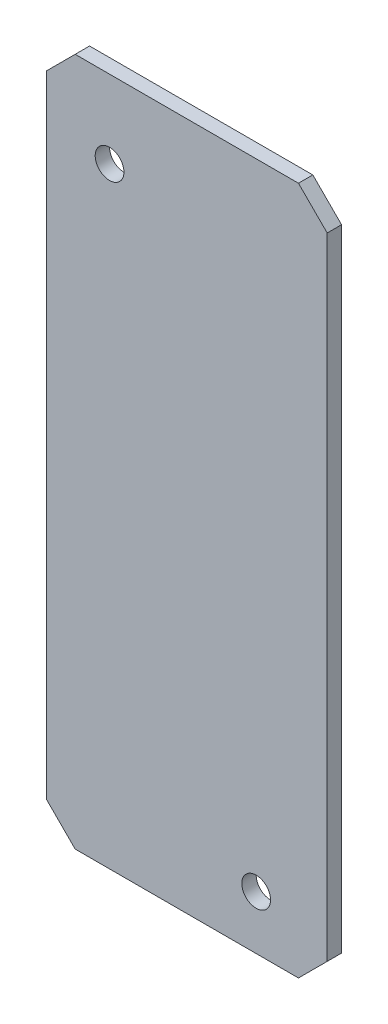
ISO-10303-21;
HEADER;
FILE_DESCRIPTION(('STEP AP214'),'2;1');
FILE_NAME('part.step','',(''),(''),'','','');
FILE_SCHEMA(('AUTOMOTIVE_DESIGN { 1 0 10303 214 1 1 1 1 }'));
ENDSEC;
DATA;
#1=APPLICATION_CONTEXT('core data for automotive mechanical design processes');
#2=APPLICATION_PROTOCOL_DEFINITION('international standard','automotive_design',2000,#1);
#3=PRODUCT_CONTEXT('',#1,'mechanical');
#4=PRODUCT('Part','Part','',(#3));
#5=PRODUCT_RELATED_PRODUCT_CATEGORY('part','',(#4));
#6=PRODUCT_DEFINITION_FORMATION('','',#4);
#7=PRODUCT_DEFINITION_CONTEXT('part definition',#1,'design');
#8=PRODUCT_DEFINITION('design','',#6,#7);
#9=PRODUCT_DEFINITION_SHAPE('','',#8);
#10=(LENGTH_UNIT() NAMED_UNIT(*) SI_UNIT(.MILLI.,.METRE.));
#11=(NAMED_UNIT(*) PLANE_ANGLE_UNIT() SI_UNIT($,.RADIAN.));
#12=(NAMED_UNIT(*) SI_UNIT($,.STERADIAN.) SOLID_ANGLE_UNIT());
#13=UNCERTAINTY_MEASURE_WITH_UNIT(LENGTH_MEASURE(1.E-05),#10,'distance_accuracy_value','');
#14=(GEOMETRIC_REPRESENTATION_CONTEXT(3) GLOBAL_UNCERTAINTY_ASSIGNED_CONTEXT((#13)) GLOBAL_UNIT_ASSIGNED_CONTEXT((#10,
#11,#12)) REPRESENTATION_CONTEXT('',''));
#15=CARTESIAN_POINT('',(0.,0.,0.));
#16=DIRECTION('',(0.,0.,1.));
#17=DIRECTION('',(1.,0.,0.));
#18=AXIS2_PLACEMENT_3D('',#15,#16,#17);
#19=CARTESIAN_POINT('',(-51.866048250082,-84.51886669578,1.));
#20=DIRECTION('',(0.,0.,1.));
#21=DIRECTION('',(1.,0.,0.));
#22=AXIS2_PLACEMENT_3D('',#19,#20,#21);
#23=PLANE('',#22);
#24=CARTESIAN_POINT('',(-37.2688330071628,-80.7890726351597,1.));
#25=DIRECTION('',(0.,0.,1.));
#26=DIRECTION('',(1.,0.,0.));
#27=AXIS2_PLACEMENT_3D('',#24,#25,#26);
#28=CIRCLE('',#27,0.999999999999998);
#29=CARTESIAN_POINT('',(-36.2688330071628,-80.7890726351597,1.));
#30=VERTEX_POINT('',#29);
#31=EDGE_CURVE('E132',#30,#30,#28,.T.);
#32=ORIENTED_EDGE('',*,*,#31,.F.);
#33=EDGE_LOOP('',(#32));
#34=FACE_BOUND('',#33,.T.);
#35=DIRECTION('',(0.,-1.,0.));
#36=VECTOR('',#35,1.);
#37=CARTESIAN_POINT('',(-51.866048250082,-36.6136660966542,1.));
#38=LINE('',#37,#36);
#39=CARTESIAN_POINT('',(-51.866048250082,-38.6136660966542,1.));
#40=VERTEX_POINT('',#39);
#41=CARTESIAN_POINT('',(-51.866048250082,-82.51886669578,1.));
#42=VERTEX_POINT('',#41);
#43=EDGE_CURVE('E137',#40,#42,#38,.T.);
#44=ORIENTED_EDGE('',*,*,#43,.T.);
#45=DIRECTION('',(-0.707106781186545,0.70710678118655,0.));
#46=VECTOR('',#45,1.);
#47=CARTESIAN_POINT('',(-50.866048250082,-83.51886669578,1.));
#48=LINE('',#47,#46);
#49=CARTESIAN_POINT('',(-49.866048250082,-84.51886669578,1.));
#50=VERTEX_POINT('',#49);
#51=EDGE_CURVE('E158',#42,#50,#48,.F.);
#52=ORIENTED_EDGE('',*,*,#51,.T.);
#53=DIRECTION('',(1.,0.,0.));
#54=VECTOR('',#53,1.);
#55=CARTESIAN_POINT('',(-51.866048250082,-84.51886669578,1.));
#56=LINE('',#55,#54);
#57=CARTESIAN_POINT('',(-34.325499768879,-84.51886669578,1.));
#58=VERTEX_POINT('',#57);
#59=EDGE_CURVE('E119',#50,#58,#56,.T.);
#60=ORIENTED_EDGE('',*,*,#59,.T.);
#61=DIRECTION('',(-0.70710678118655,-0.707106781186545,0.));
#62=VECTOR('',#61,1.);
#63=CARTESIAN_POINT('',(-43.0957740094805,-93.2891409363815,1.));
#64=LINE('',#63,#62);
#65=CARTESIAN_POINT('',(-32.3254997688789,-82.51886669578,1.));
#66=VERTEX_POINT('',#65);
#67=EDGE_CURVE('E156',#58,#66,#64,.F.);
#68=ORIENTED_EDGE('',*,*,#67,.T.);
#69=DIRECTION('',(0.,1.,0.));
#70=VECTOR('',#69,1.);
#71=CARTESIAN_POINT('',(-32.3254997688789,-36.6136660966542,1.));
#72=LINE('',#71,#70);
#73=CARTESIAN_POINT('',(-32.325499768879,-38.6136660966542,1.));
#74=VERTEX_POINT('',#73);
#75=EDGE_CURVE('E141',#66,#74,#72,.T.);
#76=ORIENTED_EDGE('',*,*,#75,.T.);
#77=DIRECTION('',(0.707106781186546,-0.707106781186549,0.));
#78=VECTOR('',#77,1.);
#79=CARTESIAN_POINT('',(-19.1431737099176,-51.7959921556157,1.));
#80=LINE('',#79,#78);
#81=CARTESIAN_POINT('',(-34.3254997688789,-36.6136660966542,1.));
#82=VERTEX_POINT('',#81);
#83=EDGE_CURVE('E54',#74,#82,#80,.F.);
#84=ORIENTED_EDGE('',*,*,#83,.T.);
#85=DIRECTION('',(-1.,0.,0.));
#86=VECTOR('',#85,1.);
#87=CARTESIAN_POINT('',(-51.866048250082,-36.6136660966542,1.));
#88=LINE('',#87,#86);
#89=CARTESIAN_POINT('',(-49.866048250082,-36.6136660966542,1.));
#90=VERTEX_POINT('',#89);
#91=EDGE_CURVE('E143',#82,#90,#88,.T.);
#92=ORIENTED_EDGE('',*,*,#91,.T.);
#93=DIRECTION('',(0.707106781186549,0.707106781186546,0.));
#94=VECTOR('',#93,1.);
#95=CARTESIAN_POINT('',(-74.8186485496449,-61.566266396217,1.));
#96=LINE('',#95,#94);
#97=EDGE_CURVE('E153',#90,#40,#96,.F.);
#98=ORIENTED_EDGE('',*,*,#97,.T.);
#99=EDGE_LOOP('',(#44,#52,#60,#68,#76,#84,#92,#98));
#100=FACE_BOUND('',#99,.T.);
#101=CARTESIAN_POINT('',(-47.4714587140537,-42.0223916794583,1.));
#102=DIRECTION('',(0.,0.,1.));
#103=DIRECTION('',(1.,0.,0.));
#104=AXIS2_PLACEMENT_3D('',#101,#102,#103);
#105=CIRCLE('',#104,0.999999999999998);
#106=CARTESIAN_POINT('',(-46.4714587140537,-42.0223916794583,1.));
#107=VERTEX_POINT('',#106);
#108=EDGE_CURVE('E290',#107,#107,#105,.T.);
#109=ORIENTED_EDGE('',*,*,#108,.F.);
#110=EDGE_LOOP('',(#109));
#111=FACE_BOUND('',#110,.T.);
#112=ADVANCED_FACE('F33',(#34,#100,#111),#23,.T.);
#113=CARTESIAN_POINT('',(-51.866048250082,-84.51886669578,0.));
#114=DIRECTION('',(0.,0.,1.));
#115=DIRECTION('',(1.,0.,0.));
#116=AXIS2_PLACEMENT_3D('',#113,#114,#115);
#117=PLANE('',#116);
#118=CARTESIAN_POINT('',(-37.2688330071628,-80.7890726351597,0.));
#119=DIRECTION('',(0.,0.,1.));
#120=DIRECTION('',(1.,0.,0.));
#121=AXIS2_PLACEMENT_3D('',#118,#119,#120);
#122=CIRCLE('',#121,0.999999999999998);
#123=CARTESIAN_POINT('',(-36.2688330071628,-80.7890726351597,0.));
#124=VERTEX_POINT('',#123);
#125=EDGE_CURVE('E289',#124,#124,#122,.T.);
#126=ORIENTED_EDGE('',*,*,#125,.T.);
#127=EDGE_LOOP('',(#126));
#128=FACE_BOUND('',#127,.T.);
#129=DIRECTION('',(1.,0.,0.));
#130=VECTOR('',#129,1.);
#131=CARTESIAN_POINT('',(-51.866048250082,-84.51886669578,0.));
#132=LINE('',#131,#130);
#133=CARTESIAN_POINT('',(-49.866048250082,-84.51886669578,0.));
#134=VERTEX_POINT('',#133);
#135=CARTESIAN_POINT('',(-34.325499768879,-84.51886669578,0.));
#136=VERTEX_POINT('',#135);
#137=EDGE_CURVE('E116',#134,#136,#132,.T.);
#138=ORIENTED_EDGE('',*,*,#137,.F.);
#139=DIRECTION('',(0.707106781186545,-0.70710678118655,0.));
#140=VECTOR('',#139,1.);
#141=CARTESIAN_POINT('',(-49.866048250082,-84.51886669578,0.));
#142=LINE('',#141,#140);
#143=CARTESIAN_POINT('',(-51.866048250082,-82.51886669578,0.));
#144=VERTEX_POINT('',#143);
#145=EDGE_CURVE('E99',#134,#144,#142,.F.);
#146=ORIENTED_EDGE('',*,*,#145,.T.);
#147=DIRECTION('',(0.,-1.,0.));
#148=VECTOR('',#147,1.);
#149=CARTESIAN_POINT('',(-51.866048250082,-36.6136660966542,0.));
#150=LINE('',#149,#148);
#151=CARTESIAN_POINT('',(-51.866048250082,-38.6136660966542,0.));
#152=VERTEX_POINT('',#151);
#153=EDGE_CURVE('E127',#152,#144,#150,.T.);
#154=ORIENTED_EDGE('',*,*,#153,.F.);
#155=DIRECTION('',(-0.707106781186549,-0.707106781186546,0.));
#156=VECTOR('',#155,1.);
#157=CARTESIAN_POINT('',(-51.866048250082,-38.6136660966542,0.));
#158=LINE('',#157,#156);
#159=CARTESIAN_POINT('',(-49.866048250082,-36.6136660966542,0.));
#160=VERTEX_POINT('',#159);
#161=EDGE_CURVE('E120',#152,#160,#158,.F.);
#162=ORIENTED_EDGE('',*,*,#161,.T.);
#163=DIRECTION('',(-1.,0.,0.));
#164=VECTOR('',#163,1.);
#165=CARTESIAN_POINT('',(-51.866048250082,-36.6136660966542,0.));
#166=LINE('',#165,#164);
#167=CARTESIAN_POINT('',(-34.325499768879,-36.6136660966542,0.));
#168=VERTEX_POINT('',#167);
#169=EDGE_CURVE('E130',#168,#160,#166,.T.);
#170=ORIENTED_EDGE('',*,*,#169,.F.);
#171=DIRECTION('',(-0.707106781186546,0.707106781186549,0.));
#172=VECTOR('',#171,1.);
#173=CARTESIAN_POINT('',(-34.3254997688789,-36.6136660966542,0.));
#174=LINE('',#173,#172);
#175=CARTESIAN_POINT('',(-32.3254997688789,-38.6136660966542,0.));
#176=VERTEX_POINT('',#175);
#177=EDGE_CURVE('E147',#168,#176,#174,.F.);
#178=ORIENTED_EDGE('',*,*,#177,.T.);
#179=DIRECTION('',(0.,1.,0.));
#180=VECTOR('',#179,1.);
#181=CARTESIAN_POINT('',(-32.3254997688789,-36.6136660966542,0.));
#182=LINE('',#181,#180);
#183=CARTESIAN_POINT('',(-32.3254997688789,-82.51886669578,0.));
#184=VERTEX_POINT('',#183);
#185=EDGE_CURVE('E126',#184,#176,#182,.T.);
#186=ORIENTED_EDGE('',*,*,#185,.F.);
#187=DIRECTION('',(0.70710678118655,0.707106781186545,0.));
#188=VECTOR('',#187,1.);
#189=CARTESIAN_POINT('',(-32.3254997688789,-82.51886669578,0.));
#190=LINE('',#189,#188);
#191=EDGE_CURVE('E110',#184,#136,#190,.F.);
#192=ORIENTED_EDGE('',*,*,#191,.T.);
#193=EDGE_LOOP('',(#138,#146,#154,#162,#170,#178,#186,#192));
#194=FACE_BOUND('',#193,.T.);
#195=CARTESIAN_POINT('',(-47.4714587140537,-42.0223916794583,0.));
#196=DIRECTION('',(0.,0.,1.));
#197=DIRECTION('',(1.,0.,0.));
#198=AXIS2_PLACEMENT_3D('',#195,#196,#197);
#199=CIRCLE('',#198,0.999999999999998);
#200=CARTESIAN_POINT('',(-46.4714587140537,-42.0223916794583,0.));
#201=VERTEX_POINT('',#200);
#202=EDGE_CURVE('E293',#201,#201,#199,.T.);
#203=ORIENTED_EDGE('',*,*,#202,.T.);
#204=EDGE_LOOP('',(#203));
#205=FACE_BOUND('',#204,.T.);
#206=ADVANCED_FACE('F123',(#128,#194,#205),#117,.F.);
#207=CARTESIAN_POINT('',(-51.866048250082,-36.6136660966542,1.));
#208=DIRECTION('',(1.,0.,0.));
#209=DIRECTION('',(0.,1.,0.));
#210=AXIS2_PLACEMENT_3D('',#207,#208,#209);
#211=PLANE('',#210);
#212=ORIENTED_EDGE('',*,*,#153,.T.);
#213=DIRECTION('',(0.,0.,1.));
#214=VECTOR('',#213,1.);
#215=CARTESIAN_POINT('',(-51.866048250082,-82.51886669578,1.));
#216=LINE('',#215,#214);
#217=EDGE_CURVE('E104',#144,#42,#216,.T.);
#218=ORIENTED_EDGE('',*,*,#217,.T.);
#219=ORIENTED_EDGE('',*,*,#43,.F.);
#220=DIRECTION('',(0.,0.,-1.));
#221=VECTOR('',#220,1.);
#222=CARTESIAN_POINT('',(-51.866048250082,-38.6136660966542,1.));
#223=LINE('',#222,#221);
#224=EDGE_CURVE('E109',#40,#152,#223,.T.);
#225=ORIENTED_EDGE('',*,*,#224,.T.);
#226=EDGE_LOOP('',(#212,#218,#219,#225));
#227=FACE_BOUND('',#226,.T.);
#228=ADVANCED_FACE('F35',(#227),#211,.F.);
#229=CARTESIAN_POINT('',(-51.866048250082,-84.51886669578,1.));
#230=DIRECTION('',(0.,1.,0.));
#231=DIRECTION('',(0.,0.,1.));
#232=AXIS2_PLACEMENT_3D('',#229,#230,#231);
#233=PLANE('',#232);
#234=ORIENTED_EDGE('',*,*,#59,.F.);
#235=DIRECTION('',(0.,0.,-1.));
#236=VECTOR('',#235,1.);
#237=CARTESIAN_POINT('',(-49.866048250082,-84.51886669578,1.));
#238=LINE('',#237,#236);
#239=EDGE_CURVE('E103',#50,#134,#238,.T.);
#240=ORIENTED_EDGE('',*,*,#239,.T.);
#241=ORIENTED_EDGE('',*,*,#137,.T.);
#242=DIRECTION('',(0.,0.,1.));
#243=VECTOR('',#242,1.);
#244=CARTESIAN_POINT('',(-34.325499768879,-84.51886669578,1.));
#245=LINE('',#244,#243);
#246=EDGE_CURVE('E121',#136,#58,#245,.T.);
#247=ORIENTED_EDGE('',*,*,#246,.T.);
#248=EDGE_LOOP('',(#234,#240,#241,#247));
#249=FACE_BOUND('',#248,.T.);
#250=ADVANCED_FACE('F115',(#249),#233,.F.);
#251=CARTESIAN_POINT('',(-32.3254997688789,-36.6136660966542,1.));
#252=DIRECTION('',(-1.,0.,0.));
#253=DIRECTION('',(0.,0.,1.));
#254=AXIS2_PLACEMENT_3D('',#251,#252,#253);
#255=PLANE('',#254);
#256=ORIENTED_EDGE('',*,*,#75,.F.);
#257=DIRECTION('',(0.,0.,-1.));
#258=VECTOR('',#257,1.);
#259=CARTESIAN_POINT('',(-32.3254997688789,-82.51886669578,1.));
#260=LINE('',#259,#258);
#261=EDGE_CURVE('E162',#66,#184,#260,.T.);
#262=ORIENTED_EDGE('',*,*,#261,.T.);
#263=ORIENTED_EDGE('',*,*,#185,.T.);
#264=DIRECTION('',(0.,0.,1.));
#265=VECTOR('',#264,1.);
#266=CARTESIAN_POINT('',(-32.3254997688789,-38.6136660966542,1.));
#267=LINE('',#266,#265);
#268=EDGE_CURVE('E160',#176,#74,#267,.T.);
#269=ORIENTED_EDGE('',*,*,#268,.T.);
#270=EDGE_LOOP('',(#256,#262,#263,#269));
#271=FACE_BOUND('',#270,.T.);
#272=ADVANCED_FACE('F167',(#271),#255,.F.);
#273=CARTESIAN_POINT('',(-51.866048250082,-36.6136660966542,1.));
#274=DIRECTION('',(0.,-1.,0.));
#275=DIRECTION('',(0.,0.,-1.));
#276=AXIS2_PLACEMENT_3D('',#273,#274,#275);
#277=PLANE('',#276);
#278=ORIENTED_EDGE('',*,*,#91,.F.);
#279=DIRECTION('',(0.,0.,-1.));
#280=VECTOR('',#279,1.);
#281=CARTESIAN_POINT('',(-34.3254997688789,-36.6136660966542,1.));
#282=LINE('',#281,#280);
#283=EDGE_CURVE('E11',#82,#168,#282,.T.);
#284=ORIENTED_EDGE('',*,*,#283,.T.);
#285=ORIENTED_EDGE('',*,*,#169,.T.);
#286=DIRECTION('',(0.,0.,1.));
#287=VECTOR('',#286,1.);
#288=CARTESIAN_POINT('',(-49.866048250082,-36.6136660966542,1.));
#289=LINE('',#288,#287);
#290=EDGE_CURVE('E41',#160,#90,#289,.T.);
#291=ORIENTED_EDGE('',*,*,#290,.T.);
#292=EDGE_LOOP('',(#278,#284,#285,#291));
#293=FACE_BOUND('',#292,.T.);
#294=ADVANCED_FACE('F175',(#293),#277,.F.);
#295=CARTESIAN_POINT('',(-37.2688330071628,-80.7890726351597,1.));
#296=DIRECTION('',(0.,0.,-1.));
#297=DIRECTION('',(-1.,0.,0.));
#298=AXIS2_PLACEMENT_3D('',#295,#296,#297);
#299=CYLINDRICAL_SURFACE('',#298,0.999999999999998);
#300=ORIENTED_EDGE('',*,*,#31,.T.);
#301=EDGE_LOOP('',(#300));
#302=FACE_BOUND('',#301,.T.);
#303=ORIENTED_EDGE('',*,*,#125,.F.);
#304=EDGE_LOOP('',(#303));
#305=FACE_BOUND('',#304,.T.);
#306=ADVANCED_FACE('F206',(#302,#305),#299,.F.);
#307=CARTESIAN_POINT('',(-47.4714587140537,-42.0223916794583,1.));
#308=DIRECTION('',(0.,0.,-1.));
#309=DIRECTION('',(-1.,0.,0.));
#310=AXIS2_PLACEMENT_3D('',#307,#308,#309);
#311=CYLINDRICAL_SURFACE('',#310,0.999999999999998);
#312=ORIENTED_EDGE('',*,*,#108,.T.);
#313=EDGE_LOOP('',(#312));
#314=FACE_BOUND('',#313,.T.);
#315=ORIENTED_EDGE('',*,*,#202,.F.);
#316=EDGE_LOOP('',(#315));
#317=FACE_BOUND('',#316,.T.);
#318=ADVANCED_FACE('F191',(#314,#317),#311,.F.);
#319=CARTESIAN_POINT('',(-49.866048250082,-84.51886669578,1.));
#320=DIRECTION('',(0.70710678118655,0.707106781186545,0.));
#321=DIRECTION('',(-0.707106781186545,0.70710678118655,0.));
#322=AXIS2_PLACEMENT_3D('',#319,#320,#321);
#323=PLANE('',#322);
#324=ORIENTED_EDGE('',*,*,#51,.F.);
#325=ORIENTED_EDGE('',*,*,#217,.F.);
#326=ORIENTED_EDGE('',*,*,#145,.F.);
#327=ORIENTED_EDGE('',*,*,#239,.F.);
#328=EDGE_LOOP('',(#324,#325,#326,#327));
#329=FACE_BOUND('',#328,.T.);
#330=ADVANCED_FACE('F102',(#329),#323,.F.);
#331=CARTESIAN_POINT('',(-32.3254997688789,-82.51886669578,1.));
#332=DIRECTION('',(-0.707106781186545,0.70710678118655,0.));
#333=DIRECTION('',(-0.70710678118655,-0.707106781186545,0.));
#334=AXIS2_PLACEMENT_3D('',#331,#332,#333);
#335=PLANE('',#334);
#336=ORIENTED_EDGE('',*,*,#67,.F.);
#337=ORIENTED_EDGE('',*,*,#246,.F.);
#338=ORIENTED_EDGE('',*,*,#191,.F.);
#339=ORIENTED_EDGE('',*,*,#261,.F.);
#340=EDGE_LOOP('',(#336,#337,#338,#339));
#341=FACE_BOUND('',#340,.T.);
#342=ADVANCED_FACE('F183',(#341),#335,.F.);
#343=CARTESIAN_POINT('',(-34.3254997688789,-36.6136660966542,1.));
#344=DIRECTION('',(-0.707106781186549,-0.707106781186546,0.));
#345=DIRECTION('',(0.707106781186546,-0.707106781186549,0.));
#346=AXIS2_PLACEMENT_3D('',#343,#344,#345);
#347=PLANE('',#346);
#348=ORIENTED_EDGE('',*,*,#83,.F.);
#349=ORIENTED_EDGE('',*,*,#268,.F.);
#350=ORIENTED_EDGE('',*,*,#177,.F.);
#351=ORIENTED_EDGE('',*,*,#283,.F.);
#352=EDGE_LOOP('',(#348,#349,#350,#351));
#353=FACE_BOUND('',#352,.T.);
#354=ADVANCED_FACE('F174',(#353),#347,.F.);
#355=CARTESIAN_POINT('',(-51.866048250082,-38.6136660966542,1.));
#356=DIRECTION('',(0.707106781186546,-0.707106781186549,0.));
#357=DIRECTION('',(0.707106781186549,0.707106781186546,0.));
#358=AXIS2_PLACEMENT_3D('',#355,#356,#357);
#359=PLANE('',#358);
#360=ORIENTED_EDGE('',*,*,#97,.F.);
#361=ORIENTED_EDGE('',*,*,#290,.F.);
#362=ORIENTED_EDGE('',*,*,#161,.F.);
#363=ORIENTED_EDGE('',*,*,#224,.F.);
#364=EDGE_LOOP('',(#360,#361,#362,#363));
#365=FACE_BOUND('',#364,.T.);
#366=ADVANCED_FACE('F181',(#365),#359,.F.);
#367=CLOSED_SHELL('',(#112,#206,#228,#250,#272,#294,#306,#318,#330,#342,#354,#366));
#368=MANIFOLD_SOLID_BREP('B2',#367);
#369=ADVANCED_BREP_SHAPE_REPRESENTATION('',(#18,#368),#14);
#370=SHAPE_DEFINITION_REPRESENTATION(#9,#369);
ENDSEC;
END-ISO-10303-21;
